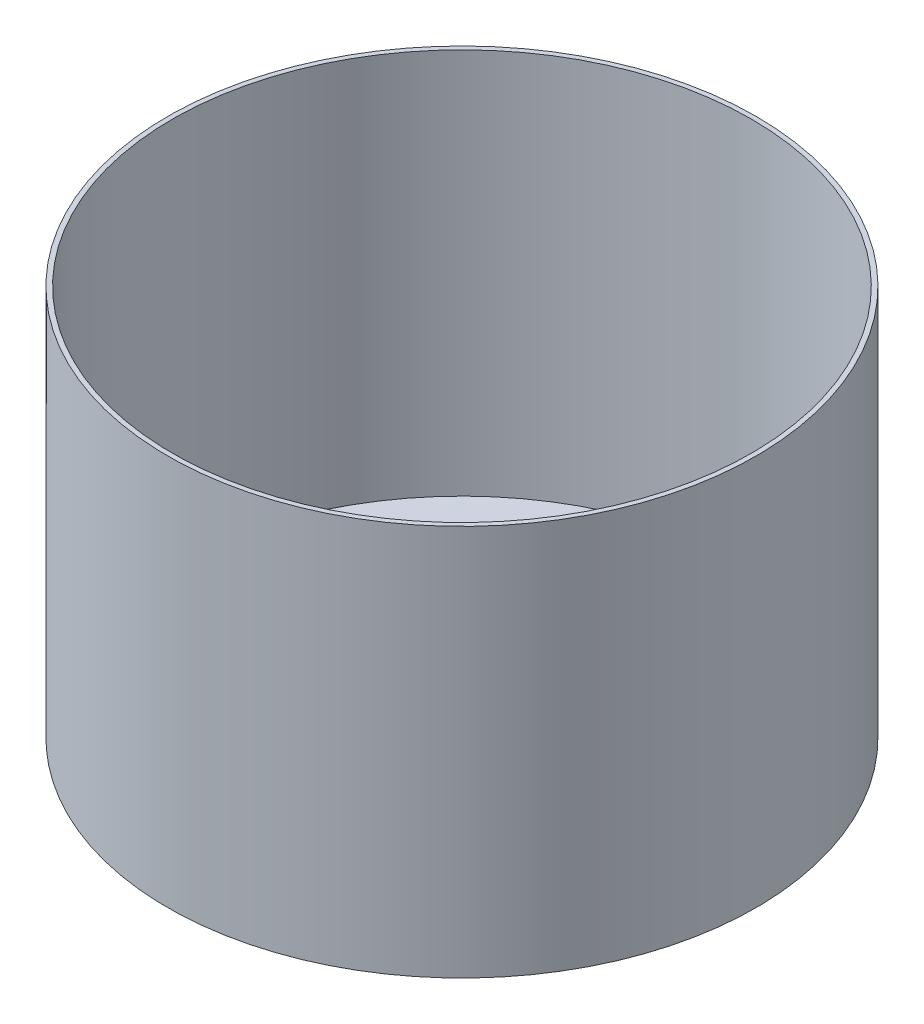
ISO-10303-21;
HEADER;
FILE_DESCRIPTION(('STEP AP214'),'2;1');
FILE_NAME('part.step','',(''),(''),'','','');
FILE_SCHEMA(('AUTOMOTIVE_DESIGN { 1 0 10303 214 1 1 1 1 }'));
ENDSEC;
DATA;
#1=APPLICATION_CONTEXT('core data for automotive mechanical design processes');
#2=APPLICATION_PROTOCOL_DEFINITION('international standard','automotive_design',2000,#1);
#3=PRODUCT_CONTEXT('',#1,'mechanical');
#4=PRODUCT('Part','Part','',(#3));
#5=PRODUCT_RELATED_PRODUCT_CATEGORY('part','',(#4));
#6=PRODUCT_DEFINITION_FORMATION('','',#4);
#7=PRODUCT_DEFINITION_CONTEXT('part definition',#1,'design');
#8=PRODUCT_DEFINITION('design','',#6,#7);
#9=PRODUCT_DEFINITION_SHAPE('','',#8);
#10=(LENGTH_UNIT() NAMED_UNIT(*) SI_UNIT(.MILLI.,.METRE.));
#11=(NAMED_UNIT(*) PLANE_ANGLE_UNIT() SI_UNIT($,.RADIAN.));
#12=(NAMED_UNIT(*) SI_UNIT($,.STERADIAN.) SOLID_ANGLE_UNIT());
#13=UNCERTAINTY_MEASURE_WITH_UNIT(LENGTH_MEASURE(1.E-05),#10,'distance_accuracy_value','');
#14=(GEOMETRIC_REPRESENTATION_CONTEXT(3) GLOBAL_UNCERTAINTY_ASSIGNED_CONTEXT((#13)) GLOBAL_UNIT_ASSIGNED_CONTEXT((#10,
#11,#12)) REPRESENTATION_CONTEXT('',''));
#15=CARTESIAN_POINT('',(0.,0.,0.));
#16=DIRECTION('',(0.,0.,1.));
#17=DIRECTION('',(1.,0.,0.));
#18=AXIS2_PLACEMENT_3D('',#15,#16,#17);
#19=CARTESIAN_POINT('',(93.98,-78.476,0.));
#20=DIRECTION('',(0.,1.,0.));
#21=DIRECTION('',(0.,0.,1.));
#22=AXIS2_PLACEMENT_3D('',#19,#20,#21);
#23=PLANE('',#22);
#24=CARTESIAN_POINT('',(0.,-78.476,0.));
#25=DIRECTION('',(0.,-1.,0.));
#26=DIRECTION('',(0.,0.,-1.));
#27=AXIS2_PLACEMENT_3D('',#24,#25,#26);
#28=CIRCLE('',#27,93.98);
#29=CARTESIAN_POINT('',(0.,-78.476,-93.98));
#30=VERTEX_POINT('',#29);
#31=EDGE_CURVE('E42',#30,#30,#28,.T.);
#32=ORIENTED_EDGE('',*,*,#31,.F.);
#33=EDGE_LOOP('',(#32));
#34=FACE_BOUND('',#33,.T.);
#35=CARTESIAN_POINT('',(-80.01,-78.476,0.));
#36=DIRECTION('',(0.,1.,0.));
#37=DIRECTION('',(0.,0.,1.));
#38=AXIS2_PLACEMENT_3D('',#35,#36,#37);
#39=CIRCLE('',#38,3.04800000000001);
#40=CARTESIAN_POINT('',(-80.01,-78.476,3.04800000000001));
#41=VERTEX_POINT('',#40);
#42=EDGE_CURVE('E77',#41,#41,#39,.F.);
#43=ORIENTED_EDGE('',*,*,#42,.T.);
#44=EDGE_LOOP('',(#43));
#45=FACE_BOUND('',#44,.T.);
#46=CARTESIAN_POINT('',(0.,-78.476,-80.01));
#47=DIRECTION('',(0.,1.,0.));
#48=DIRECTION('',(0.,0.,1.));
#49=AXIS2_PLACEMENT_3D('',#46,#47,#48);
#50=CIRCLE('',#49,3.048);
#51=CARTESIAN_POINT('',(0.,-78.476,-76.962));
#52=VERTEX_POINT('',#51);
#53=EDGE_CURVE('E66',#52,#52,#50,.F.);
#54=ORIENTED_EDGE('',*,*,#53,.T.);
#55=EDGE_LOOP('',(#54));
#56=FACE_BOUND('',#55,.T.);
#57=CARTESIAN_POINT('',(80.01,-78.476,0.));
#58=DIRECTION('',(0.,1.,0.));
#59=DIRECTION('',(0.,0.,1.));
#60=AXIS2_PLACEMENT_3D('',#57,#58,#59);
#61=CIRCLE('',#60,3.04800000000001);
#62=CARTESIAN_POINT('',(80.01,-78.476,3.04800000000001));
#63=VERTEX_POINT('',#62);
#64=EDGE_CURVE('E65',#63,#63,#61,.F.);
#65=ORIENTED_EDGE('',*,*,#64,.T.);
#66=EDGE_LOOP('',(#65));
#67=FACE_BOUND('',#66,.T.);
#68=CARTESIAN_POINT('',(0.,-78.476,80.01));
#69=DIRECTION('',(0.,1.,0.));
#70=DIRECTION('',(0.,0.,1.));
#71=AXIS2_PLACEMENT_3D('',#68,#69,#70);
#72=CIRCLE('',#71,3.048);
#73=CARTESIAN_POINT('',(0.,-78.476,83.058));
#74=VERTEX_POINT('',#73);
#75=EDGE_CURVE('E59',#74,#74,#72,.F.);
#76=ORIENTED_EDGE('',*,*,#75,.T.);
#77=EDGE_LOOP('',(#76));
#78=FACE_BOUND('',#77,.T.);
#79=CARTESIAN_POINT('',(0.,-78.476,0.));
#80=DIRECTION('',(0.,1.,0.));
#81=DIRECTION('',(0.,0.,1.));
#82=AXIS2_PLACEMENT_3D('',#79,#80,#81);
#83=CIRCLE('',#82,25.4);
#84=CARTESIAN_POINT('',(0.,-78.476,25.4));
#85=VERTEX_POINT('',#84);
#86=EDGE_CURVE('E56',#85,#85,#83,.F.);
#87=ORIENTED_EDGE('',*,*,#86,.T.);
#88=EDGE_LOOP('',(#87));
#89=FACE_BOUND('',#88,.T.);
#90=ADVANCED_FACE('F35',(#34,#45,#56,#67,#78,#89),#23,.T.);
#91=CARTESIAN_POINT('',(0.,0.,0.));
#92=DIRECTION('',(0.,-1.,0.));
#93=DIRECTION('',(0.,0.,-1.));
#94=AXIS2_PLACEMENT_3D('',#91,#92,#93);
#95=CYLINDRICAL_SURFACE('',#94,95.504);
#96=CARTESIAN_POINT('',(0.,47.,0.));
#97=DIRECTION('',(0.,-1.,0.));
#98=DIRECTION('',(0.,0.,-1.));
#99=AXIS2_PLACEMENT_3D('',#96,#97,#98);
#100=CIRCLE('',#99,95.504);
#101=CARTESIAN_POINT('',(0.,47.,-95.504));
#102=VERTEX_POINT('',#101);
#103=EDGE_CURVE('E50',#102,#102,#100,.T.);
#104=ORIENTED_EDGE('',*,*,#103,.T.);
#105=EDGE_LOOP('',(#104));
#106=FACE_BOUND('',#105,.T.);
#107=CARTESIAN_POINT('',(0.,-80.,0.));
#108=DIRECTION('',(0.,-1.,0.));
#109=DIRECTION('',(0.,0.,-1.));
#110=AXIS2_PLACEMENT_3D('',#107,#108,#109);
#111=CIRCLE('',#110,95.504);
#112=CARTESIAN_POINT('',(0.,-80.,-95.504));
#113=VERTEX_POINT('',#112);
#114=EDGE_CURVE('E10',#113,#113,#111,.T.);
#115=ORIENTED_EDGE('',*,*,#114,.F.);
#116=EDGE_LOOP('',(#115));
#117=FACE_BOUND('',#116,.T.);
#118=ADVANCED_FACE('F37',(#106,#117),#95,.T.);
#119=CARTESIAN_POINT('',(95.504,-80.,0.));
#120=DIRECTION('',(0.,-1.,0.));
#121=DIRECTION('',(0.,0.,-1.));
#122=AXIS2_PLACEMENT_3D('',#119,#120,#121);
#123=PLANE('',#122);
#124=CARTESIAN_POINT('',(0.,-80.,80.01));
#125=DIRECTION('',(0.,-1.,0.));
#126=DIRECTION('',(0.,0.,-1.));
#127=AXIS2_PLACEMENT_3D('',#124,#125,#126);
#128=CIRCLE('',#127,3.048);
#129=CARTESIAN_POINT('',(0.,-80.,76.962));
#130=VERTEX_POINT('',#129);
#131=EDGE_CURVE('E69',#130,#130,#128,.T.);
#132=ORIENTED_EDGE('',*,*,#131,.F.);
#133=EDGE_LOOP('',(#132));
#134=FACE_BOUND('',#133,.T.);
#135=CARTESIAN_POINT('',(80.01,-80.,0.));
#136=DIRECTION('',(0.,-1.,0.));
#137=DIRECTION('',(0.,0.,-1.));
#138=AXIS2_PLACEMENT_3D('',#135,#136,#137);
#139=CIRCLE('',#138,3.04800000000001);
#140=CARTESIAN_POINT('',(80.01,-80.,-3.04800000000001));
#141=VERTEX_POINT('',#140);
#142=EDGE_CURVE('E62',#141,#141,#139,.T.);
#143=ORIENTED_EDGE('',*,*,#142,.F.);
#144=EDGE_LOOP('',(#143));
#145=FACE_BOUND('',#144,.T.);
#146=CARTESIAN_POINT('',(0.,-80.,-80.01));
#147=DIRECTION('',(0.,-1.,0.));
#148=DIRECTION('',(0.,0.,-1.));
#149=AXIS2_PLACEMENT_3D('',#146,#147,#148);
#150=CIRCLE('',#149,3.048);
#151=CARTESIAN_POINT('',(0.,-80.,-83.058));
#152=VERTEX_POINT('',#151);
#153=EDGE_CURVE('E80',#152,#152,#150,.T.);
#154=ORIENTED_EDGE('',*,*,#153,.F.);
#155=EDGE_LOOP('',(#154));
#156=FACE_BOUND('',#155,.T.);
#157=CARTESIAN_POINT('',(-80.01,-80.,0.));
#158=DIRECTION('',(0.,-1.,0.));
#159=DIRECTION('',(0.,0.,-1.));
#160=AXIS2_PLACEMENT_3D('',#157,#158,#159);
#161=CIRCLE('',#160,3.04800000000001);
#162=CARTESIAN_POINT('',(-80.01,-80.,-3.04800000000001));
#163=VERTEX_POINT('',#162);
#164=EDGE_CURVE('E74',#163,#163,#161,.T.);
#165=ORIENTED_EDGE('',*,*,#164,.F.);
#166=EDGE_LOOP('',(#165));
#167=FACE_BOUND('',#166,.T.);
#168=CARTESIAN_POINT('',(0.,-80.,0.));
#169=DIRECTION('',(0.,-1.,0.));
#170=DIRECTION('',(0.,0.,-1.));
#171=AXIS2_PLACEMENT_3D('',#168,#169,#170);
#172=CIRCLE('',#171,25.4);
#173=CARTESIAN_POINT('',(0.,-80.,-25.4));
#174=VERTEX_POINT('',#173);
#175=EDGE_CURVE('E55',#174,#174,#172,.T.);
#176=ORIENTED_EDGE('',*,*,#175,.F.);
#177=EDGE_LOOP('',(#176));
#178=FACE_BOUND('',#177,.T.);
#179=ORIENTED_EDGE('',*,*,#114,.T.);
#180=EDGE_LOOP('',(#179));
#181=FACE_BOUND('',#180,.T.);
#182=ADVANCED_FACE('F96',(#134,#145,#156,#167,#178,#181),#123,.T.);
#183=CARTESIAN_POINT('',(0.,0.,0.));
#184=DIRECTION('',(0.,-1.,0.));
#185=DIRECTION('',(0.,0.,-1.));
#186=AXIS2_PLACEMENT_3D('',#183,#184,#185);
#187=CYLINDRICAL_SURFACE('',#186,93.98);
#188=ORIENTED_EDGE('',*,*,#31,.T.);
#189=EDGE_LOOP('',(#188));
#190=FACE_BOUND('',#189,.T.);
#191=CARTESIAN_POINT('',(0.,47.,0.));
#192=DIRECTION('',(0.,-1.,0.));
#193=DIRECTION('',(0.,0.,-1.));
#194=AXIS2_PLACEMENT_3D('',#191,#192,#193);
#195=CIRCLE('',#194,93.98);
#196=CARTESIAN_POINT('',(0.,47.,-93.98));
#197=VERTEX_POINT('',#196);
#198=EDGE_CURVE('E46',#197,#197,#195,.T.);
#199=ORIENTED_EDGE('',*,*,#198,.F.);
#200=EDGE_LOOP('',(#199));
#201=FACE_BOUND('',#200,.T.);
#202=ADVANCED_FACE('F99',(#190,#201),#187,.F.);
#203=CARTESIAN_POINT('',(93.98,47.,0.));
#204=DIRECTION('',(0.,1.,0.));
#205=DIRECTION('',(0.,0.,1.));
#206=AXIS2_PLACEMENT_3D('',#203,#204,#205);
#207=PLANE('',#206);
#208=ORIENTED_EDGE('',*,*,#198,.T.);
#209=EDGE_LOOP('',(#208));
#210=FACE_BOUND('',#209,.T.);
#211=ORIENTED_EDGE('',*,*,#103,.F.);
#212=EDGE_LOOP('',(#211));
#213=FACE_BOUND('',#212,.T.);
#214=ADVANCED_FACE('F128',(#210,#213),#207,.T.);
#215=CARTESIAN_POINT('',(-80.01,47.001,0.));
#216=DIRECTION('',(0.,-1.,0.));
#217=DIRECTION('',(0.,0.,-1.));
#218=AXIS2_PLACEMENT_3D('',#215,#216,#217);
#219=CYLINDRICAL_SURFACE('',#218,3.04800000000001);
#220=ORIENTED_EDGE('',*,*,#42,.F.);
#221=EDGE_LOOP('',(#220));
#222=FACE_BOUND('',#221,.T.);
#223=ORIENTED_EDGE('',*,*,#164,.T.);
#224=EDGE_LOOP('',(#223));
#225=FACE_BOUND('',#224,.T.);
#226=ADVANCED_FACE('F92',(#222,#225),#219,.F.);
#227=CARTESIAN_POINT('',(0.,47.001,-80.01));
#228=DIRECTION('',(0.,-1.,0.));
#229=DIRECTION('',(0.,0.,-1.));
#230=AXIS2_PLACEMENT_3D('',#227,#228,#229);
#231=CYLINDRICAL_SURFACE('',#230,3.048);
#232=ORIENTED_EDGE('',*,*,#53,.F.);
#233=EDGE_LOOP('',(#232));
#234=FACE_BOUND('',#233,.T.);
#235=ORIENTED_EDGE('',*,*,#153,.T.);
#236=EDGE_LOOP('',(#235));
#237=FACE_BOUND('',#236,.T.);
#238=ADVANCED_FACE('F88',(#234,#237),#231,.F.);
#239=CARTESIAN_POINT('',(80.01,47.001,0.));
#240=DIRECTION('',(0.,-1.,0.));
#241=DIRECTION('',(0.,0.,-1.));
#242=AXIS2_PLACEMENT_3D('',#239,#240,#241);
#243=CYLINDRICAL_SURFACE('',#242,3.04800000000001);
#244=ORIENTED_EDGE('',*,*,#64,.F.);
#245=EDGE_LOOP('',(#244));
#246=FACE_BOUND('',#245,.T.);
#247=ORIENTED_EDGE('',*,*,#142,.T.);
#248=EDGE_LOOP('',(#247));
#249=FACE_BOUND('',#248,.T.);
#250=ADVANCED_FACE('F91',(#246,#249),#243,.F.);
#251=CARTESIAN_POINT('',(0.,47.001,80.01));
#252=DIRECTION('',(0.,-1.,0.));
#253=DIRECTION('',(0.,0.,-1.));
#254=AXIS2_PLACEMENT_3D('',#251,#252,#253);
#255=CYLINDRICAL_SURFACE('',#254,3.048);
#256=ORIENTED_EDGE('',*,*,#75,.F.);
#257=EDGE_LOOP('',(#256));
#258=FACE_BOUND('',#257,.T.);
#259=ORIENTED_EDGE('',*,*,#131,.T.);
#260=EDGE_LOOP('',(#259));
#261=FACE_BOUND('',#260,.T.);
#262=ADVANCED_FACE('F107',(#258,#261),#255,.F.);
#263=CARTESIAN_POINT('',(0.,47.001,0.));
#264=DIRECTION('',(0.,-1.,0.));
#265=DIRECTION('',(0.,0.,-1.));
#266=AXIS2_PLACEMENT_3D('',#263,#264,#265);
#267=CYLINDRICAL_SURFACE('',#266,25.4);
#268=ORIENTED_EDGE('',*,*,#86,.F.);
#269=EDGE_LOOP('',(#268));
#270=FACE_BOUND('',#269,.T.);
#271=ORIENTED_EDGE('',*,*,#175,.T.);
#272=EDGE_LOOP('',(#271));
#273=FACE_BOUND('',#272,.T.);
#274=ADVANCED_FACE('F105',(#270,#273),#267,.F.);
#275=CLOSED_SHELL('',(#90,#118,#182,#202,#214,#226,#238,#250,#262,#274));
#276=MANIFOLD_SOLID_BREP('B2',#275);
#277=ADVANCED_BREP_SHAPE_REPRESENTATION('',(#18,#276),#14);
#278=SHAPE_DEFINITION_REPRESENTATION(#9,#277);
ENDSEC;
END-ISO-10303-21;
